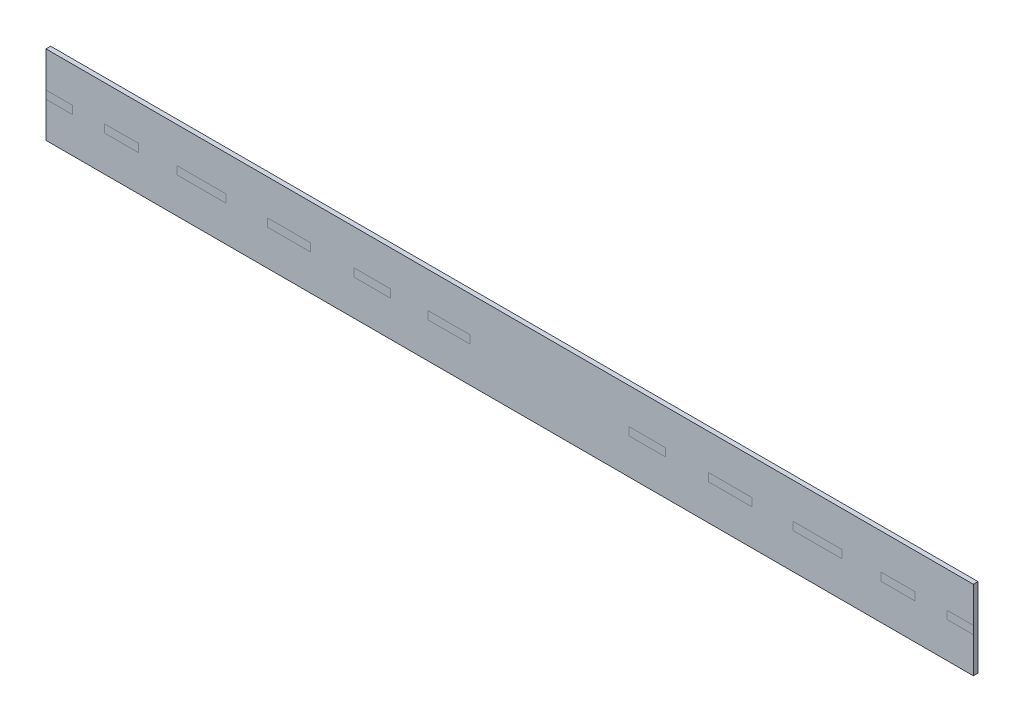
ISO-10303-21;
HEADER;
FILE_DESCRIPTION(('STEP AP214'),'2;1');
FILE_NAME('part.step','',(''),(''),'','','');
FILE_SCHEMA(('AUTOMOTIVE_DESIGN { 1 0 10303 214 1 1 1 1 }'));
ENDSEC;
DATA;
#1=APPLICATION_CONTEXT('core data for automotive mechanical design processes');
#2=APPLICATION_PROTOCOL_DEFINITION('international standard','automotive_design',2000,#1);
#3=PRODUCT_CONTEXT('',#1,'mechanical');
#4=PRODUCT('Part','Part','',(#3));
#5=PRODUCT_RELATED_PRODUCT_CATEGORY('part','',(#4));
#6=PRODUCT_DEFINITION_FORMATION('','',#4);
#7=PRODUCT_DEFINITION_CONTEXT('part definition',#1,'design');
#8=PRODUCT_DEFINITION('design','',#6,#7);
#9=PRODUCT_DEFINITION_SHAPE('','',#8);
#10=(LENGTH_UNIT() NAMED_UNIT(*) SI_UNIT(.MILLI.,.METRE.));
#11=(NAMED_UNIT(*) PLANE_ANGLE_UNIT() SI_UNIT($,.RADIAN.));
#12=(NAMED_UNIT(*) SI_UNIT($,.STERADIAN.) SOLID_ANGLE_UNIT());
#13=UNCERTAINTY_MEASURE_WITH_UNIT(LENGTH_MEASURE(1.E-05),#10,'distance_accuracy_value','');
#14=(GEOMETRIC_REPRESENTATION_CONTEXT(3) GLOBAL_UNCERTAINTY_ASSIGNED_CONTEXT((#13)) GLOBAL_UNIT_ASSIGNED_CONTEXT((#10,
#11,#12)) REPRESENTATION_CONTEXT('',''));
#15=CARTESIAN_POINT('',(0.,0.,0.));
#16=DIRECTION('',(0.,0.,1.));
#17=DIRECTION('',(1.,0.,0.));
#18=AXIS2_PLACEMENT_3D('',#15,#16,#17);
#19=CARTESIAN_POINT('',(0.,0.,10.));
#20=DIRECTION('',(0.,0.,1.));
#21=DIRECTION('',(1.,0.,0.));
#22=AXIS2_PLACEMENT_3D('',#19,#20,#21);
#23=PLANE('',#22);
#24=DIRECTION('',(0.,-1.,0.));
#25=VECTOR('',#24,1.);
#26=CARTESIAN_POINT('',(-943.339491197588,0.,10.));
#27=LINE('',#26,#25);
#28=CARTESIAN_POINT('',(-943.339491197588,8.68153363789784,10.));
#29=VERTEX_POINT('',#28);
#30=CARTESIAN_POINT('',(-943.339491197588,-8.68153363789784,10.));
#31=VERTEX_POINT('',#30);
#32=EDGE_CURVE('E264',#29,#31,#27,.T.);
#33=ORIENTED_EDGE('',*,*,#32,.T.);
#34=DIRECTION('',(-1.,0.,0.));
#35=VECTOR('',#34,1.);
#36=CARTESIAN_POINT('',(0.,-8.68153363789784,10.));
#37=LINE('',#36,#35);
#38=CARTESIAN_POINT('',(-1000.,-8.68153363789784,10.));
#39=VERTEX_POINT('',#38);
#40=EDGE_CURVE('E267',#31,#39,#37,.T.);
#41=ORIENTED_EDGE('',*,*,#40,.T.);
#42=DIRECTION('',(0.,-1.,0.));
#43=VECTOR('',#42,1.);
#44=CARTESIAN_POINT('',(-1000.,85.5,10.));
#45=LINE('',#44,#43);
#46=CARTESIAN_POINT('',(-1000.,-85.5,10.));
#47=VERTEX_POINT('',#46);
#48=EDGE_CURVE('E240',#39,#47,#45,.T.);
#49=ORIENTED_EDGE('',*,*,#48,.T.);
#50=DIRECTION('',(1.,0.,0.));
#51=VECTOR('',#50,1.);
#52=CARTESIAN_POINT('',(-1000.,-85.5,10.));
#53=LINE('',#52,#51);
#54=CARTESIAN_POINT('',(1000.,-85.5,10.));
#55=VERTEX_POINT('',#54);
#56=EDGE_CURVE('E448',#47,#55,#53,.T.);
#57=ORIENTED_EDGE('',*,*,#56,.T.);
#58=DIRECTION('',(0.,1.,0.));
#59=VECTOR('',#58,1.);
#60=CARTESIAN_POINT('',(1000.,85.5,10.));
#61=LINE('',#60,#59);
#62=CARTESIAN_POINT('',(1000.,-8.68153363789784,10.));
#63=VERTEX_POINT('',#62);
#64=EDGE_CURVE('E230',#55,#63,#61,.T.);
#65=ORIENTED_EDGE('',*,*,#64,.T.);
#66=DIRECTION('',(-1.,0.,0.));
#67=VECTOR('',#66,1.);
#68=CARTESIAN_POINT('',(0.,-8.68153363789784,10.));
#69=LINE('',#68,#67);
#70=CARTESIAN_POINT('',(943.339491197588,-8.68153363789784,10.));
#71=VERTEX_POINT('',#70);
#72=EDGE_CURVE('E257',#63,#71,#69,.T.);
#73=ORIENTED_EDGE('',*,*,#72,.T.);
#74=DIRECTION('',(0.,1.,0.));
#75=VECTOR('',#74,1.);
#76=CARTESIAN_POINT('',(943.339491197588,0.,10.));
#77=LINE('',#76,#75);
#78=CARTESIAN_POINT('',(943.339491197588,8.68153363789784,10.));
#79=VERTEX_POINT('',#78);
#80=EDGE_CURVE('E246',#71,#79,#77,.T.);
#81=ORIENTED_EDGE('',*,*,#80,.T.);
#82=DIRECTION('',(1.,0.,0.));
#83=VECTOR('',#82,1.);
#84=CARTESIAN_POINT('',(0.,8.68153363789784,10.));
#85=LINE('',#84,#83);
#86=CARTESIAN_POINT('',(1000.,8.68153363789784,10.));
#87=VERTEX_POINT('',#86);
#88=EDGE_CURVE('E221',#79,#87,#85,.T.);
#89=ORIENTED_EDGE('',*,*,#88,.T.);
#90=CARTESIAN_POINT('',(1000.,85.5,10.));
#91=VERTEX_POINT('',#90);
#92=EDGE_CURVE('E213',#87,#91,#61,.T.);
#93=ORIENTED_EDGE('',*,*,#92,.T.);
#94=DIRECTION('',(-1.,0.,0.));
#95=VECTOR('',#94,1.);
#96=CARTESIAN_POINT('',(-1000.,85.5,10.));
#97=LINE('',#96,#95);
#98=CARTESIAN_POINT('',(-1000.,85.5,10.));
#99=VERTEX_POINT('',#98);
#100=EDGE_CURVE('E218',#91,#99,#97,.T.);
#101=ORIENTED_EDGE('',*,*,#100,.T.);
#102=CARTESIAN_POINT('',(-1000.,8.68153363789784,10.));
#103=VERTEX_POINT('',#102);
#104=EDGE_CURVE('E442',#99,#103,#45,.T.);
#105=ORIENTED_EDGE('',*,*,#104,.T.);
#106=DIRECTION('',(1.,0.,0.));
#107=VECTOR('',#106,1.);
#108=CARTESIAN_POINT('',(0.,8.68153363789784,10.));
#109=LINE('',#108,#107);
#110=EDGE_CURVE('E260',#103,#29,#109,.T.);
#111=ORIENTED_EDGE('',*,*,#110,.T.);
#112=EDGE_LOOP('',(#33,#41,#49,#57,#65,#73,#81,#89,#93,#101,#105,#111));
#113=FACE_BOUND('',#112,.T.);
#114=DIRECTION('',(0.,1.,0.));
#115=VECTOR('',#114,1.);
#116=CARTESIAN_POINT('',(-874.078139754039,0.,10.));
#117=LINE('',#116,#115);
#118=CARTESIAN_POINT('',(-874.078139754039,-8.68153363789784,10.));
#119=VERTEX_POINT('',#118);
#120=CARTESIAN_POINT('',(-874.078139754039,8.68153363789784,10.));
#121=VERTEX_POINT('',#120);
#122=EDGE_CURVE('E278',#119,#121,#117,.T.);
#123=ORIENTED_EDGE('',*,*,#122,.T.);
#124=DIRECTION('',(1.,0.,0.));
#125=VECTOR('',#124,1.);
#126=CARTESIAN_POINT('',(0.,8.68153363789784,10.));
#127=LINE('',#126,#125);
#128=CARTESIAN_POINT('',(-800.742591166751,8.68153363789784,10.));
#129=VERTEX_POINT('',#128);
#130=EDGE_CURVE('E282',#121,#129,#127,.T.);
#131=ORIENTED_EDGE('',*,*,#130,.T.);
#132=DIRECTION('',(0.,-1.,0.));
#133=VECTOR('',#132,1.);
#134=CARTESIAN_POINT('',(-800.742591166751,0.,10.));
#135=LINE('',#134,#133);
#136=CARTESIAN_POINT('',(-800.742591166751,-8.68153363789784,10.));
#137=VERTEX_POINT('',#136);
#138=EDGE_CURVE('E270',#129,#137,#135,.T.);
#139=ORIENTED_EDGE('',*,*,#138,.T.);
#140=DIRECTION('',(-1.,0.,0.));
#141=VECTOR('',#140,1.);
#142=CARTESIAN_POINT('',(0.,-8.68153363789784,10.));
#143=LINE('',#142,#141);
#144=EDGE_CURVE('E274',#137,#119,#143,.T.);
#145=ORIENTED_EDGE('',*,*,#144,.T.);
#146=EDGE_LOOP('',(#123,#131,#139,#145));
#147=FACE_BOUND('',#146,.T.);
#148=DIRECTION('',(0.,1.,0.));
#149=VECTOR('',#148,1.);
#150=CARTESIAN_POINT('',(-717.221549720118,0.,10.));
#151=LINE('',#150,#149);
#152=CARTESIAN_POINT('',(-717.221549720118,-8.68153363789784,10.));
#153=VERTEX_POINT('',#152);
#154=CARTESIAN_POINT('',(-717.221549720118,8.68153363789784,10.));
#155=VERTEX_POINT('',#154);
#156=EDGE_CURVE('E293',#153,#155,#151,.T.);
#157=ORIENTED_EDGE('',*,*,#156,.T.);
#158=DIRECTION('',(1.,0.,0.));
#159=VECTOR('',#158,1.);
#160=CARTESIAN_POINT('',(0.,8.68153363789784,10.));
#161=LINE('',#160,#159);
#162=CARTESIAN_POINT('',(-611.292423982924,8.68153363789784,10.));
#163=VERTEX_POINT('',#162);
#164=EDGE_CURVE('E297',#155,#163,#161,.T.);
#165=ORIENTED_EDGE('',*,*,#164,.T.);
#166=DIRECTION('',(0.,-1.,0.));
#167=VECTOR('',#166,1.);
#168=CARTESIAN_POINT('',(-611.292423982924,0.,10.));
#169=LINE('',#168,#167);
#170=CARTESIAN_POINT('',(-611.292423982924,-8.68153363789784,10.));
#171=VERTEX_POINT('',#170);
#172=EDGE_CURVE('E285',#163,#171,#169,.T.);
#173=ORIENTED_EDGE('',*,*,#172,.T.);
#174=DIRECTION('',(-1.,0.,0.));
#175=VECTOR('',#174,1.);
#176=CARTESIAN_POINT('',(0.,-8.68153363789784,10.));
#177=LINE('',#176,#175);
#178=EDGE_CURVE('E289',#171,#153,#177,.T.);
#179=ORIENTED_EDGE('',*,*,#178,.T.);
#180=EDGE_LOOP('',(#157,#165,#173,#179));
#181=FACE_BOUND('',#180,.T.);
#182=DIRECTION('',(0.,1.,0.));
#183=VECTOR('',#182,1.);
#184=CARTESIAN_POINT('',(-522.678636106618,0.,10.));
#185=LINE('',#184,#183);
#186=CARTESIAN_POINT('',(-522.678636106618,-8.68153363789784,10.));
#187=VERTEX_POINT('',#186);
#188=CARTESIAN_POINT('',(-522.678636106618,8.68153363789784,10.));
#189=VERTEX_POINT('',#188);
#190=EDGE_CURVE('E308',#187,#189,#185,.T.);
#191=ORIENTED_EDGE('',*,*,#190,.T.);
#192=DIRECTION('',(1.,0.,0.));
#193=VECTOR('',#192,1.);
#194=CARTESIAN_POINT('',(0.,8.68153363789784,10.));
#195=LINE('',#194,#193);
#196=CARTESIAN_POINT('',(-429.080705067474,8.68153363789784,10.));
#197=VERTEX_POINT('',#196);
#198=EDGE_CURVE('E312',#189,#197,#195,.T.);
#199=ORIENTED_EDGE('',*,*,#198,.T.);
#200=DIRECTION('',(0.,-1.,0.));
#201=VECTOR('',#200,1.);
#202=CARTESIAN_POINT('',(-429.080705067474,0.,10.));
#203=LINE('',#202,#201);
#204=CARTESIAN_POINT('',(-429.080705067474,-8.68153363789784,10.));
#205=VERTEX_POINT('',#204);
#206=EDGE_CURVE('E300',#197,#205,#203,.T.);
#207=ORIENTED_EDGE('',*,*,#206,.T.);
#208=DIRECTION('',(-1.,0.,0.));
#209=VECTOR('',#208,1.);
#210=CARTESIAN_POINT('',(0.,-8.68153363789784,10.));
#211=LINE('',#210,#209);
#212=EDGE_CURVE('E304',#205,#187,#211,.T.);
#213=ORIENTED_EDGE('',*,*,#212,.T.);
#214=EDGE_LOOP('',(#191,#199,#207,#213));
#215=FACE_BOUND('',#214,.T.);
#216=DIRECTION('',(0.,1.,0.));
#217=VECTOR('',#216,1.);
#218=CARTESIAN_POINT('',(-336.24749881918,0.,10.));
#219=LINE('',#218,#217);
#220=CARTESIAN_POINT('',(-336.24749881918,-8.68153363789784,10.));
#221=VERTEX_POINT('',#220);
#222=CARTESIAN_POINT('',(-336.24749881918,8.68153363789784,10.));
#223=VERTEX_POINT('',#222);
#224=EDGE_CURVE('E323',#221,#223,#219,.T.);
#225=ORIENTED_EDGE('',*,*,#224,.T.);
#226=DIRECTION('',(1.,0.,0.));
#227=VECTOR('',#226,1.);
#228=CARTESIAN_POINT('',(0.,8.68153363789784,10.));
#229=LINE('',#228,#227);
#230=CARTESIAN_POINT('',(-257.098296703915,8.68153363789784,10.));
#231=VERTEX_POINT('',#230);
#232=EDGE_CURVE('E327',#223,#231,#229,.T.);
#233=ORIENTED_EDGE('',*,*,#232,.T.);
#234=DIRECTION('',(0.,-1.,0.));
#235=VECTOR('',#234,1.);
#236=CARTESIAN_POINT('',(-257.098296703915,0.,10.));
#237=LINE('',#236,#235);
#238=CARTESIAN_POINT('',(-257.098296703915,-8.68153363789784,10.));
#239=VERTEX_POINT('',#238);
#240=EDGE_CURVE('E315',#231,#239,#237,.T.);
#241=ORIENTED_EDGE('',*,*,#240,.T.);
#242=DIRECTION('',(-1.,0.,0.));
#243=VECTOR('',#242,1.);
#244=CARTESIAN_POINT('',(0.,-8.68153363789784,10.));
#245=LINE('',#244,#243);
#246=EDGE_CURVE('E319',#239,#221,#245,.T.);
#247=ORIENTED_EDGE('',*,*,#246,.T.);
#248=EDGE_LOOP('',(#225,#233,#241,#247));
#249=FACE_BOUND('',#248,.T.);
#250=DIRECTION('',(0.,1.,0.));
#251=VECTOR('',#250,1.);
#252=CARTESIAN_POINT('',(-175.918005755628,0.,10.));
#253=LINE('',#252,#251);
#254=CARTESIAN_POINT('',(-175.918005755628,-8.68153363789784,10.));
#255=VERTEX_POINT('',#254);
#256=CARTESIAN_POINT('',(-175.918005755628,8.68153363789784,10.));
#257=VERTEX_POINT('',#256);
#258=EDGE_CURVE('E335',#255,#257,#253,.T.);
#259=ORIENTED_EDGE('',*,*,#258,.T.);
#260=DIRECTION('',(1.,0.,0.));
#261=VECTOR('',#260,1.);
#262=CARTESIAN_POINT('',(0.,8.68153363789784,10.));
#263=LINE('',#262,#261);
#264=CARTESIAN_POINT('',(-85.4702403873622,8.68153363789784,10.));
#265=VERTEX_POINT('',#264);
#266=EDGE_CURVE('E331',#257,#265,#263,.T.);
#267=ORIENTED_EDGE('',*,*,#266,.T.);
#268=DIRECTION('',(0.,-1.,0.));
#269=VECTOR('',#268,1.);
#270=CARTESIAN_POINT('',(-85.4702403873622,0.,10.));
#271=LINE('',#270,#269);
#272=CARTESIAN_POINT('',(-85.4702403873622,-8.68153363789784,10.));
#273=VERTEX_POINT('',#272);
#274=EDGE_CURVE('E330',#265,#273,#271,.T.);
#275=ORIENTED_EDGE('',*,*,#274,.T.);
#276=DIRECTION('',(-1.,0.,0.));
#277=VECTOR('',#276,1.);
#278=CARTESIAN_POINT('',(0.,-8.68153363789784,10.));
#279=LINE('',#278,#277);
#280=EDGE_CURVE('E339',#273,#255,#279,.T.);
#281=ORIENTED_EDGE('',*,*,#280,.T.);
#282=EDGE_LOOP('',(#259,#267,#275,#281));
#283=FACE_BOUND('',#282,.T.);
#284=DIRECTION('',(0.,1.,0.));
#285=VECTOR('',#284,1.);
#286=CARTESIAN_POINT('',(800.742591166751,0.,10.));
#287=LINE('',#286,#285);
#288=CARTESIAN_POINT('',(800.742591166751,-8.68153363789784,10.));
#289=VERTEX_POINT('',#288);
#290=CARTESIAN_POINT('',(800.742591166751,8.68153363789784,10.));
#291=VERTEX_POINT('',#290);
#292=EDGE_CURVE('E350',#289,#291,#287,.T.);
#293=ORIENTED_EDGE('',*,*,#292,.T.);
#294=DIRECTION('',(1.,0.,0.));
#295=VECTOR('',#294,1.);
#296=CARTESIAN_POINT('',(0.,8.68153363789784,10.));
#297=LINE('',#296,#295);
#298=CARTESIAN_POINT('',(874.078139754039,8.68153363789784,10.));
#299=VERTEX_POINT('',#298);
#300=EDGE_CURVE('E346',#291,#299,#297,.T.);
#301=ORIENTED_EDGE('',*,*,#300,.T.);
#302=DIRECTION('',(0.,-1.,0.));
#303=VECTOR('',#302,1.);
#304=CARTESIAN_POINT('',(874.078139754039,0.,10.));
#305=LINE('',#304,#303);
#306=CARTESIAN_POINT('',(874.078139754039,-8.68153363789784,10.));
#307=VERTEX_POINT('',#306);
#308=EDGE_CURVE('E334',#299,#307,#305,.T.);
#309=ORIENTED_EDGE('',*,*,#308,.T.);
#310=DIRECTION('',(-1.,0.,0.));
#311=VECTOR('',#310,1.);
#312=CARTESIAN_POINT('',(0.,-8.68153363789784,10.));
#313=LINE('',#312,#311);
#314=EDGE_CURVE('E354',#307,#289,#313,.T.);
#315=ORIENTED_EDGE('',*,*,#314,.T.);
#316=EDGE_LOOP('',(#293,#301,#309,#315));
#317=FACE_BOUND('',#316,.T.);
#318=DIRECTION('',(0.,1.,0.));
#319=VECTOR('',#318,1.);
#320=CARTESIAN_POINT('',(611.292423982924,0.,10.));
#321=LINE('',#320,#319);
#322=CARTESIAN_POINT('',(611.292423982924,-8.68153363789784,10.));
#323=VERTEX_POINT('',#322);
#324=CARTESIAN_POINT('',(611.292423982924,8.68153363789784,10.));
#325=VERTEX_POINT('',#324);
#326=EDGE_CURVE('E365',#323,#325,#321,.T.);
#327=ORIENTED_EDGE('',*,*,#326,.T.);
#328=DIRECTION('',(1.,0.,0.));
#329=VECTOR('',#328,1.);
#330=CARTESIAN_POINT('',(0.,8.68153363789784,10.));
#331=LINE('',#330,#329);
#332=CARTESIAN_POINT('',(717.221549720118,8.68153363789784,10.));
#333=VERTEX_POINT('',#332);
#334=EDGE_CURVE('E361',#325,#333,#331,.T.);
#335=ORIENTED_EDGE('',*,*,#334,.T.);
#336=DIRECTION('',(0.,-1.,0.));
#337=VECTOR('',#336,1.);
#338=CARTESIAN_POINT('',(717.221549720118,0.,10.));
#339=LINE('',#338,#337);
#340=CARTESIAN_POINT('',(717.221549720118,-8.68153363789784,10.));
#341=VERTEX_POINT('',#340);
#342=EDGE_CURVE('E349',#333,#341,#339,.T.);
#343=ORIENTED_EDGE('',*,*,#342,.T.);
#344=DIRECTION('',(-1.,0.,0.));
#345=VECTOR('',#344,1.);
#346=CARTESIAN_POINT('',(0.,-8.68153363789784,10.));
#347=LINE('',#346,#345);
#348=EDGE_CURVE('E369',#341,#323,#347,.T.);
#349=ORIENTED_EDGE('',*,*,#348,.T.);
#350=EDGE_LOOP('',(#327,#335,#343,#349));
#351=FACE_BOUND('',#350,.T.);
#352=DIRECTION('',(0.,1.,0.));
#353=VECTOR('',#352,1.);
#354=CARTESIAN_POINT('',(429.080705067474,0.,10.));
#355=LINE('',#354,#353);
#356=CARTESIAN_POINT('',(429.080705067474,-8.68153363789784,10.));
#357=VERTEX_POINT('',#356);
#358=CARTESIAN_POINT('',(429.080705067474,8.68153363789784,10.));
#359=VERTEX_POINT('',#358);
#360=EDGE_CURVE('E379',#357,#359,#355,.T.);
#361=ORIENTED_EDGE('',*,*,#360,.T.);
#362=DIRECTION('',(1.,0.,0.));
#363=VECTOR('',#362,1.);
#364=CARTESIAN_POINT('',(0.,8.68153363789784,10.));
#365=LINE('',#364,#363);
#366=CARTESIAN_POINT('',(522.678636106618,8.68153363789784,10.));
#367=VERTEX_POINT('',#366);
#368=EDGE_CURVE('E376',#359,#367,#365,.T.);
#369=ORIENTED_EDGE('',*,*,#368,.T.);
#370=DIRECTION('',(0.,-1.,0.));
#371=VECTOR('',#370,1.);
#372=CARTESIAN_POINT('',(522.678636106618,0.,10.));
#373=LINE('',#372,#371);
#374=CARTESIAN_POINT('',(522.678636106618,-8.68153363789784,10.));
#375=VERTEX_POINT('',#374);
#376=EDGE_CURVE('E364',#367,#375,#373,.T.);
#377=ORIENTED_EDGE('',*,*,#376,.T.);
#378=DIRECTION('',(-1.,0.,0.));
#379=VECTOR('',#378,1.);
#380=CARTESIAN_POINT('',(0.,-8.68153363789784,10.));
#381=LINE('',#380,#379);
#382=EDGE_CURVE('E383',#375,#357,#381,.T.);
#383=ORIENTED_EDGE('',*,*,#382,.T.);
#384=EDGE_LOOP('',(#361,#369,#377,#383));
#385=FACE_BOUND('',#384,.T.);
#386=DIRECTION('',(0.,1.,0.));
#387=VECTOR('',#386,1.);
#388=CARTESIAN_POINT('',(257.098296703915,0.,10.));
#389=LINE('',#388,#387);
#390=CARTESIAN_POINT('',(257.098296703915,-8.68153363789784,10.));
#391=VERTEX_POINT('',#390);
#392=CARTESIAN_POINT('',(257.098296703915,8.68153363789784,10.));
#393=VERTEX_POINT('',#392);
#394=EDGE_CURVE('E53',#391,#393,#389,.T.);
#395=ORIENTED_EDGE('',*,*,#394,.T.);
#396=DIRECTION('',(1.,0.,0.));
#397=VECTOR('',#396,1.);
#398=CARTESIAN_POINT('',(0.,8.68153363789784,10.));
#399=LINE('',#398,#397);
#400=CARTESIAN_POINT('',(336.24749881918,8.68153363789784,10.));
#401=VERTEX_POINT('',#400);
#402=EDGE_CURVE('E11',#393,#401,#399,.T.);
#403=ORIENTED_EDGE('',*,*,#402,.T.);
#404=DIRECTION('',(0.,-1.,0.));
#405=VECTOR('',#404,1.);
#406=CARTESIAN_POINT('',(336.24749881918,0.,10.));
#407=LINE('',#406,#405);
#408=CARTESIAN_POINT('',(336.24749881918,-8.68153363789784,10.));
#409=VERTEX_POINT('',#408);
#410=EDGE_CURVE('E47',#401,#409,#407,.T.);
#411=ORIENTED_EDGE('',*,*,#410,.T.);
#412=DIRECTION('',(-1.,0.,0.));
#413=VECTOR('',#412,1.);
#414=CARTESIAN_POINT('',(0.,-8.68153363789784,10.));
#415=LINE('',#414,#413);
#416=EDGE_CURVE('E391',#409,#391,#415,.T.);
#417=ORIENTED_EDGE('',*,*,#416,.T.);
#418=EDGE_LOOP('',(#395,#403,#411,#417));
#419=FACE_BOUND('',#418,.T.);
#420=ADVANCED_FACE('F43',(#113,#147,#181,#215,#249,#283,#317,#351,#385,#419),#23,.T.);
#421=ORIENTED_EDGE('',*,*,#402,.F.);
#422=ORIENTED_EDGE('',*,*,#394,.F.);
#423=ORIENTED_EDGE('',*,*,#416,.F.);
#424=ORIENTED_EDGE('',*,*,#410,.F.);
#425=EDGE_LOOP('',(#421,#422,#423,#424));
#426=FACE_BOUND('',#425,.T.);
#427=ADVANCED_FACE('F398',(#426),#23,.T.);
#428=ORIENTED_EDGE('',*,*,#368,.F.);
#429=ORIENTED_EDGE('',*,*,#360,.F.);
#430=ORIENTED_EDGE('',*,*,#382,.F.);
#431=ORIENTED_EDGE('',*,*,#376,.F.);
#432=EDGE_LOOP('',(#428,#429,#430,#431));
#433=FACE_BOUND('',#432,.T.);
#434=ADVANCED_FACE('F400',(#433),#23,.T.);
#435=ORIENTED_EDGE('',*,*,#334,.F.);
#436=ORIENTED_EDGE('',*,*,#326,.F.);
#437=ORIENTED_EDGE('',*,*,#348,.F.);
#438=ORIENTED_EDGE('',*,*,#342,.F.);
#439=EDGE_LOOP('',(#435,#436,#437,#438));
#440=FACE_BOUND('',#439,.T.);
#441=ADVANCED_FACE('F406',(#440),#23,.T.);
#442=ORIENTED_EDGE('',*,*,#300,.F.);
#443=ORIENTED_EDGE('',*,*,#292,.F.);
#444=ORIENTED_EDGE('',*,*,#314,.F.);
#445=ORIENTED_EDGE('',*,*,#308,.F.);
#446=EDGE_LOOP('',(#442,#443,#444,#445));
#447=FACE_BOUND('',#446,.T.);
#448=ADVANCED_FACE('F492',(#447),#23,.T.);
#449=ORIENTED_EDGE('',*,*,#266,.F.);
#450=ORIENTED_EDGE('',*,*,#258,.F.);
#451=ORIENTED_EDGE('',*,*,#280,.F.);
#452=ORIENTED_EDGE('',*,*,#274,.F.);
#453=EDGE_LOOP('',(#449,#450,#451,#452));
#454=FACE_BOUND('',#453,.T.);
#455=ADVANCED_FACE('F496',(#454),#23,.T.);
#456=ORIENTED_EDGE('',*,*,#232,.F.);
#457=ORIENTED_EDGE('',*,*,#224,.F.);
#458=ORIENTED_EDGE('',*,*,#246,.F.);
#459=ORIENTED_EDGE('',*,*,#240,.F.);
#460=EDGE_LOOP('',(#456,#457,#458,#459));
#461=FACE_BOUND('',#460,.T.);
#462=ADVANCED_FACE('F501',(#461),#23,.T.);
#463=ORIENTED_EDGE('',*,*,#198,.F.);
#464=ORIENTED_EDGE('',*,*,#190,.F.);
#465=ORIENTED_EDGE('',*,*,#212,.F.);
#466=ORIENTED_EDGE('',*,*,#206,.F.);
#467=EDGE_LOOP('',(#463,#464,#465,#466));
#468=FACE_BOUND('',#467,.T.);
#469=ADVANCED_FACE('F478',(#468),#23,.T.);
#470=ORIENTED_EDGE('',*,*,#164,.F.);
#471=ORIENTED_EDGE('',*,*,#156,.F.);
#472=ORIENTED_EDGE('',*,*,#178,.F.);
#473=ORIENTED_EDGE('',*,*,#172,.F.);
#474=EDGE_LOOP('',(#470,#471,#472,#473));
#475=FACE_BOUND('',#474,.T.);
#476=ADVANCED_FACE('F436',(#475),#23,.T.);
#477=ORIENTED_EDGE('',*,*,#130,.F.);
#478=ORIENTED_EDGE('',*,*,#122,.F.);
#479=ORIENTED_EDGE('',*,*,#144,.F.);
#480=ORIENTED_EDGE('',*,*,#138,.F.);
#481=EDGE_LOOP('',(#477,#478,#479,#480));
#482=FACE_BOUND('',#481,.T.);
#483=ADVANCED_FACE('F431',(#482),#23,.T.);
#484=ORIENTED_EDGE('',*,*,#40,.F.);
#485=ORIENTED_EDGE('',*,*,#32,.F.);
#486=ORIENTED_EDGE('',*,*,#110,.F.);
#487=EDGE_CURVE('E440',#103,#39,#45,.T.);
#488=ORIENTED_EDGE('',*,*,#487,.T.);
#489=EDGE_LOOP('',(#484,#485,#486,#488));
#490=FACE_BOUND('',#489,.T.);
#491=ADVANCED_FACE('F414',(#490),#23,.T.);
#492=CARTESIAN_POINT('',(1000.,85.5,10.));
#493=DIRECTION('',(-1.,0.,0.));
#494=DIRECTION('',(0.,0.,1.));
#495=AXIS2_PLACEMENT_3D('',#492,#493,#494);
#496=PLANE('',#495);
#497=DIRECTION('',(0.,1.,0.));
#498=VECTOR('',#497,1.);
#499=CARTESIAN_POINT('',(1000.,85.5,0.));
#500=LINE('',#499,#498);
#501=CARTESIAN_POINT('',(1000.,-85.5,0.));
#502=VERTEX_POINT('',#501);
#503=CARTESIAN_POINT('',(1000.,85.5,0.));
#504=VERTEX_POINT('',#503);
#505=EDGE_CURVE('E244',#502,#504,#500,.T.);
#506=ORIENTED_EDGE('',*,*,#505,.T.);
#507=DIRECTION('',(0.,0.,-1.));
#508=VECTOR('',#507,1.);
#509=CARTESIAN_POINT('',(1000.,85.5,10.));
#510=LINE('',#509,#508);
#511=EDGE_CURVE('E234',#91,#504,#510,.T.);
#512=ORIENTED_EDGE('',*,*,#511,.F.);
#513=ORIENTED_EDGE('',*,*,#92,.F.);
#514=EDGE_CURVE('E227',#63,#87,#61,.T.);
#515=ORIENTED_EDGE('',*,*,#514,.F.);
#516=ORIENTED_EDGE('',*,*,#64,.F.);
#517=DIRECTION('',(0.,0.,-1.));
#518=VECTOR('',#517,1.);
#519=CARTESIAN_POINT('',(1000.,-85.5,10.));
#520=LINE('',#519,#518);
#521=EDGE_CURVE('E452',#55,#502,#520,.T.);
#522=ORIENTED_EDGE('',*,*,#521,.T.);
#523=EDGE_LOOP('',(#506,#512,#513,#515,#516,#522));
#524=FACE_BOUND('',#523,.T.);
#525=ADVANCED_FACE('F45',(#524),#496,.F.);
#526=CARTESIAN_POINT('',(-1000.,85.5,10.));
#527=DIRECTION('',(0.,-1.,0.));
#528=DIRECTION('',(0.,0.,-1.));
#529=AXIS2_PLACEMENT_3D('',#526,#527,#528);
#530=PLANE('',#529);
#531=DIRECTION('',(-1.,0.,0.));
#532=VECTOR('',#531,1.);
#533=CARTESIAN_POINT('',(-1000.,85.5,0.));
#534=LINE('',#533,#532);
#535=CARTESIAN_POINT('',(-1000.,85.5,0.));
#536=VERTEX_POINT('',#535);
#537=EDGE_CURVE('E455',#504,#536,#534,.T.);
#538=ORIENTED_EDGE('',*,*,#537,.T.);
#539=DIRECTION('',(0.,0.,-1.));
#540=VECTOR('',#539,1.);
#541=CARTESIAN_POINT('',(-1000.,85.5,10.));
#542=LINE('',#541,#540);
#543=EDGE_CURVE('E237',#99,#536,#542,.T.);
#544=ORIENTED_EDGE('',*,*,#543,.F.);
#545=ORIENTED_EDGE('',*,*,#100,.F.);
#546=ORIENTED_EDGE('',*,*,#511,.T.);
#547=EDGE_LOOP('',(#538,#544,#545,#546));
#548=FACE_BOUND('',#547,.T.);
#549=ADVANCED_FACE('F233',(#548),#530,.F.);
#550=CARTESIAN_POINT('',(-1000.,85.5,10.));
#551=DIRECTION('',(1.,0.,0.));
#552=DIRECTION('',(0.,0.,-1.));
#553=AXIS2_PLACEMENT_3D('',#550,#551,#552);
#554=PLANE('',#553);
#555=DIRECTION('',(0.,-1.,0.));
#556=VECTOR('',#555,1.);
#557=CARTESIAN_POINT('',(-1000.,85.5,0.));
#558=LINE('',#557,#556);
#559=CARTESIAN_POINT('',(-1000.,-85.5,0.));
#560=VERTEX_POINT('',#559);
#561=EDGE_CURVE('E458',#536,#560,#558,.T.);
#562=ORIENTED_EDGE('',*,*,#561,.T.);
#563=DIRECTION('',(0.,0.,-1.));
#564=VECTOR('',#563,1.);
#565=CARTESIAN_POINT('',(-1000.,-85.5,10.));
#566=LINE('',#565,#564);
#567=EDGE_CURVE('E251',#47,#560,#566,.T.);
#568=ORIENTED_EDGE('',*,*,#567,.F.);
#569=ORIENTED_EDGE('',*,*,#48,.F.);
#570=ORIENTED_EDGE('',*,*,#487,.F.);
#571=ORIENTED_EDGE('',*,*,#104,.F.);
#572=ORIENTED_EDGE('',*,*,#543,.T.);
#573=EDGE_LOOP('',(#562,#568,#569,#570,#571,#572));
#574=FACE_BOUND('',#573,.T.);
#575=ADVANCED_FACE('F420',(#574),#554,.F.);
#576=CARTESIAN_POINT('',(-1000.,-85.5,10.));
#577=DIRECTION('',(0.,1.,0.));
#578=DIRECTION('',(0.,0.,1.));
#579=AXIS2_PLACEMENT_3D('',#576,#577,#578);
#580=PLANE('',#579);
#581=DIRECTION('',(1.,0.,0.));
#582=VECTOR('',#581,1.);
#583=CARTESIAN_POINT('',(-1000.,-85.5,0.));
#584=LINE('',#583,#582);
#585=EDGE_CURVE('E228',#560,#502,#584,.T.);
#586=ORIENTED_EDGE('',*,*,#585,.T.);
#587=ORIENTED_EDGE('',*,*,#521,.F.);
#588=ORIENTED_EDGE('',*,*,#56,.F.);
#589=ORIENTED_EDGE('',*,*,#567,.T.);
#590=EDGE_LOOP('',(#586,#587,#588,#589));
#591=FACE_BOUND('',#590,.T.);
#592=ADVANCED_FACE('F412',(#591),#580,.F.);
#593=ORIENTED_EDGE('',*,*,#72,.F.);
#594=ORIENTED_EDGE('',*,*,#514,.T.);
#595=ORIENTED_EDGE('',*,*,#88,.F.);
#596=ORIENTED_EDGE('',*,*,#80,.F.);
#597=EDGE_LOOP('',(#593,#594,#595,#596));
#598=FACE_BOUND('',#597,.T.);
#599=ADVANCED_FACE('F408',(#598),#23,.T.);
#600=CARTESIAN_POINT('',(0.,0.,0.));
#601=DIRECTION('',(0.,0.,1.));
#602=DIRECTION('',(1.,0.,0.));
#603=AXIS2_PLACEMENT_3D('',#600,#601,#602);
#604=PLANE('',#603);
#605=ORIENTED_EDGE('',*,*,#505,.F.);
#606=ORIENTED_EDGE('',*,*,#585,.F.);
#607=ORIENTED_EDGE('',*,*,#561,.F.);
#608=ORIENTED_EDGE('',*,*,#537,.F.);
#609=EDGE_LOOP('',(#605,#606,#607,#608));
#610=FACE_BOUND('',#609,.T.);
#611=ADVANCED_FACE('F411',(#610),#604,.F.);
#612=CLOSED_SHELL('',(#420,#427,#434,#441,#448,#455,#462,#469,#476,#483,#491,#525,#549,#575,
#592,#599,#611));
#613=MANIFOLD_SOLID_BREP('B2',#612);
#614=ADVANCED_BREP_SHAPE_REPRESENTATION('',(#18,#613),#14);
#615=SHAPE_DEFINITION_REPRESENTATION(#9,#614);
ENDSEC;
END-ISO-10303-21;
